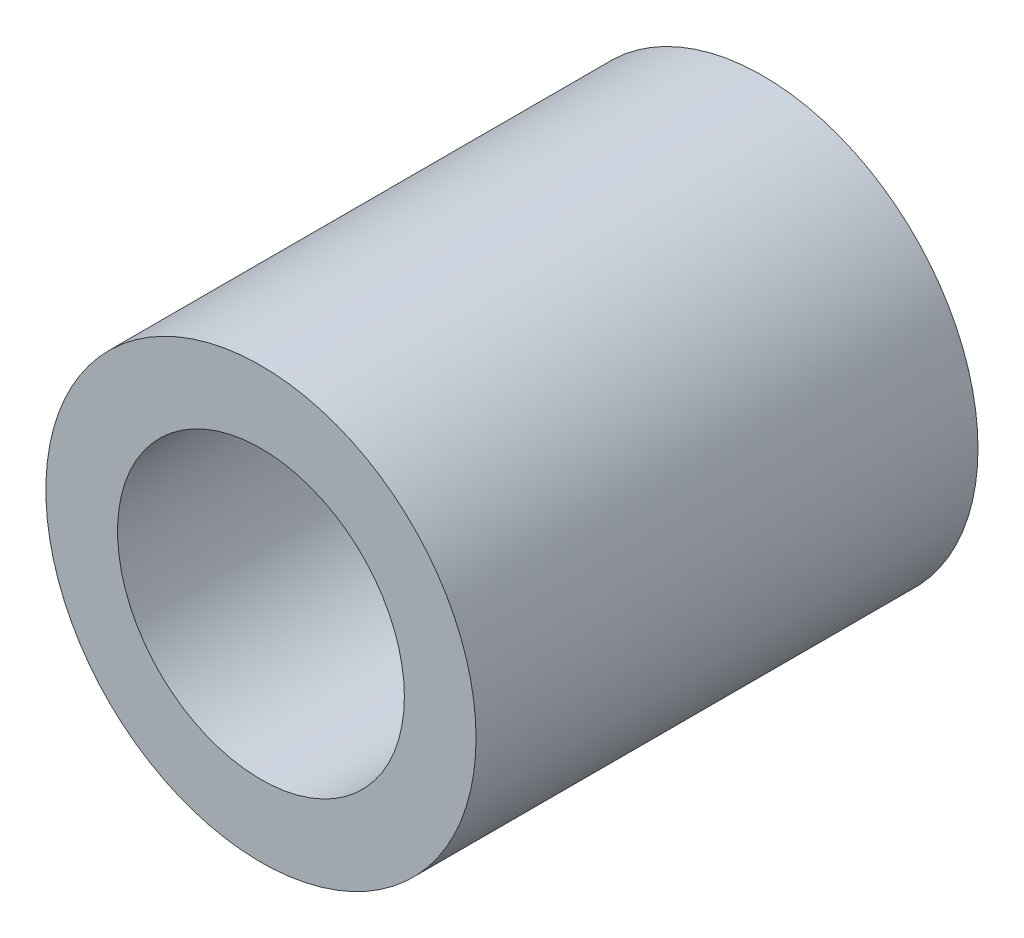
ISO-10303-21;
HEADER;
FILE_DESCRIPTION(('STEP AP214'),'2;1');
FILE_NAME('part.step','',(''),(''),'','','');
FILE_SCHEMA(('AUTOMOTIVE_DESIGN { 1 0 10303 214 1 1 1 1 }'));
ENDSEC;
DATA;
#1=APPLICATION_CONTEXT('core data for automotive mechanical design processes');
#2=APPLICATION_PROTOCOL_DEFINITION('international standard','automotive_design',2000,#1);
#3=PRODUCT_CONTEXT('',#1,'mechanical');
#4=PRODUCT('Part','Part','',(#3));
#5=PRODUCT_RELATED_PRODUCT_CATEGORY('part','',(#4));
#6=PRODUCT_DEFINITION_FORMATION('','',#4);
#7=PRODUCT_DEFINITION_CONTEXT('part definition',#1,'design');
#8=PRODUCT_DEFINITION('design','',#6,#7);
#9=PRODUCT_DEFINITION_SHAPE('','',#8);
#10=(LENGTH_UNIT() NAMED_UNIT(*) SI_UNIT(.MILLI.,.METRE.));
#11=(NAMED_UNIT(*) PLANE_ANGLE_UNIT() SI_UNIT($,.RADIAN.));
#12=(NAMED_UNIT(*) SI_UNIT($,.STERADIAN.) SOLID_ANGLE_UNIT());
#13=UNCERTAINTY_MEASURE_WITH_UNIT(LENGTH_MEASURE(1.E-05),#10,'distance_accuracy_value','');
#14=(GEOMETRIC_REPRESENTATION_CONTEXT(3) GLOBAL_UNCERTAINTY_ASSIGNED_CONTEXT((#13)) GLOBAL_UNIT_ASSIGNED_CONTEXT((#10,
#11,#12)) REPRESENTATION_CONTEXT('',''));
#15=CARTESIAN_POINT('',(0.,0.,0.));
#16=DIRECTION('',(0.,0.,1.));
#17=DIRECTION('',(1.,0.,0.));
#18=AXIS2_PLACEMENT_3D('',#15,#16,#17);
#19=CARTESIAN_POINT('',(0.,0.,7.));
#20=DIRECTION('',(0.,0.,1.));
#21=DIRECTION('',(1.,0.,0.));
#22=AXIS2_PLACEMENT_3D('',#19,#20,#21);
#23=PLANE('',#22);
#24=CARTESIAN_POINT('',(0.,0.,7.));
#25=DIRECTION('',(0.,0.,1.));
#26=DIRECTION('',(1.,0.,0.));
#27=AXIS2_PLACEMENT_3D('',#24,#25,#26);
#28=CIRCLE('',#27,3.);
#29=CARTESIAN_POINT('',(3.,0.,7.));
#30=VERTEX_POINT('',#29);
#31=EDGE_CURVE('E10',#30,#30,#28,.T.);
#32=ORIENTED_EDGE('',*,*,#31,.T.);
#33=EDGE_LOOP('',(#32));
#34=FACE_BOUND('',#33,.T.);
#35=CARTESIAN_POINT('',(0.,0.,7.));
#36=DIRECTION('',(0.,0.,1.));
#37=DIRECTION('',(1.,0.,0.));
#38=AXIS2_PLACEMENT_3D('',#35,#36,#37);
#39=CIRCLE('',#38,2.);
#40=CARTESIAN_POINT('',(2.,0.,7.));
#41=VERTEX_POINT('',#40);
#42=EDGE_CURVE('E43',#41,#41,#39,.T.);
#43=ORIENTED_EDGE('',*,*,#42,.F.);
#44=EDGE_LOOP('',(#43));
#45=FACE_BOUND('',#44,.T.);
#46=ADVANCED_FACE('F32',(#34,#45),#23,.T.);
#47=CARTESIAN_POINT('',(0.,0.,0.));
#48=DIRECTION('',(0.,0.,1.));
#49=DIRECTION('',(1.,0.,0.));
#50=AXIS2_PLACEMENT_3D('',#47,#48,#49);
#51=PLANE('',#50);
#52=CARTESIAN_POINT('',(0.,0.,0.));
#53=DIRECTION('',(0.,0.,1.));
#54=DIRECTION('',(1.,0.,0.));
#55=AXIS2_PLACEMENT_3D('',#52,#53,#54);
#56=CIRCLE('',#55,3.);
#57=CARTESIAN_POINT('',(3.,0.,0.));
#58=VERTEX_POINT('',#57);
#59=EDGE_CURVE('E36',#58,#58,#56,.T.);
#60=ORIENTED_EDGE('',*,*,#59,.F.);
#61=EDGE_LOOP('',(#60));
#62=FACE_BOUND('',#61,.T.);
#63=CARTESIAN_POINT('',(0.,0.,0.));
#64=DIRECTION('',(0.,0.,1.));
#65=DIRECTION('',(1.,0.,0.));
#66=AXIS2_PLACEMENT_3D('',#63,#64,#65);
#67=CIRCLE('',#66,2.);
#68=CARTESIAN_POINT('',(2.,0.,0.));
#69=VERTEX_POINT('',#68);
#70=EDGE_CURVE('E45',#69,#69,#67,.T.);
#71=ORIENTED_EDGE('',*,*,#70,.T.);
#72=EDGE_LOOP('',(#71));
#73=FACE_BOUND('',#72,.T.);
#74=ADVANCED_FACE('F55',(#62,#73),#51,.F.);
#75=CARTESIAN_POINT('',(0.,0.,7.));
#76=DIRECTION('',(0.,0.,-1.));
#77=DIRECTION('',(-1.,0.,0.));
#78=AXIS2_PLACEMENT_3D('',#75,#76,#77);
#79=CYLINDRICAL_SURFACE('',#78,3.);
#80=ORIENTED_EDGE('',*,*,#31,.F.);
#81=EDGE_LOOP('',(#80));
#82=FACE_BOUND('',#81,.T.);
#83=ORIENTED_EDGE('',*,*,#59,.T.);
#84=EDGE_LOOP('',(#83));
#85=FACE_BOUND('',#84,.T.);
#86=ADVANCED_FACE('F34',(#82,#85),#79,.T.);
#87=CARTESIAN_POINT('',(0.,0.,7.));
#88=DIRECTION('',(0.,0.,-1.));
#89=DIRECTION('',(-1.,0.,0.));
#90=AXIS2_PLACEMENT_3D('',#87,#88,#89);
#91=CYLINDRICAL_SURFACE('',#90,2.);
#92=ORIENTED_EDGE('',*,*,#42,.T.);
#93=EDGE_LOOP('',(#92));
#94=FACE_BOUND('',#93,.T.);
#95=ORIENTED_EDGE('',*,*,#70,.F.);
#96=EDGE_LOOP('',(#95));
#97=FACE_BOUND('',#96,.T.);
#98=ADVANCED_FACE('F51',(#94,#97),#91,.F.);
#99=CLOSED_SHELL('',(#46,#74,#86,#98));
#100=MANIFOLD_SOLID_BREP('B2',#99);
#101=ADVANCED_BREP_SHAPE_REPRESENTATION('',(#18,#100),#14);
#102=SHAPE_DEFINITION_REPRESENTATION(#9,#101);
ENDSEC;
END-ISO-10303-21;
